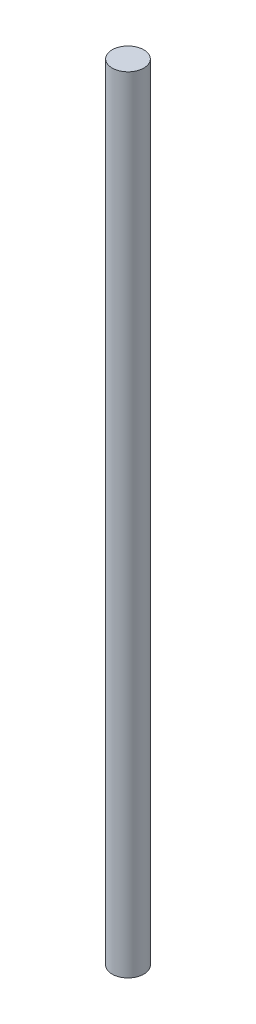
ISO-10303-21;
HEADER;
FILE_DESCRIPTION(('STEP AP214'),'2;1');
FILE_NAME('part.step','',(''),(''),'','','');
FILE_SCHEMA(('AUTOMOTIVE_DESIGN { 1 0 10303 214 1 1 1 1 }'));
ENDSEC;
DATA;
#1=APPLICATION_CONTEXT('core data for automotive mechanical design processes');
#2=APPLICATION_PROTOCOL_DEFINITION('international standard','automotive_design',2000,#1);
#3=PRODUCT_CONTEXT('',#1,'mechanical');
#4=PRODUCT('Part','Part','',(#3));
#5=PRODUCT_RELATED_PRODUCT_CATEGORY('part','',(#4));
#6=PRODUCT_DEFINITION_FORMATION('','',#4);
#7=PRODUCT_DEFINITION_CONTEXT('part definition',#1,'design');
#8=PRODUCT_DEFINITION('design','',#6,#7);
#9=PRODUCT_DEFINITION_SHAPE('','',#8);
#10=(LENGTH_UNIT() NAMED_UNIT(*) SI_UNIT(.MILLI.,.METRE.));
#11=(NAMED_UNIT(*) PLANE_ANGLE_UNIT() SI_UNIT($,.RADIAN.));
#12=(NAMED_UNIT(*) SI_UNIT($,.STERADIAN.) SOLID_ANGLE_UNIT());
#13=UNCERTAINTY_MEASURE_WITH_UNIT(LENGTH_MEASURE(1.E-05),#10,'distance_accuracy_value','');
#14=(GEOMETRIC_REPRESENTATION_CONTEXT(3) GLOBAL_UNCERTAINTY_ASSIGNED_CONTEXT((#13)) GLOBAL_UNIT_ASSIGNED_CONTEXT((#10,
#11,#12)) REPRESENTATION_CONTEXT('',''));
#15=CARTESIAN_POINT('',(0.,0.,0.));
#16=DIRECTION('',(0.,0.,1.));
#17=DIRECTION('',(1.,0.,0.));
#18=AXIS2_PLACEMENT_3D('',#15,#16,#17);
#19=CARTESIAN_POINT('',(0.,-4.8,0.));
#20=DIRECTION('',(0.,-1.,0.));
#21=DIRECTION('',(1.,0.,0.));
#22=AXIS2_PLACEMENT_3D('',#19,#20,#21);
#23=PLANE('',#22);
#24=CARTESIAN_POINT('',(0.,-4.8,0.));
#25=DIRECTION('',(0.,1.,0.));
#26=DIRECTION('',(-1.,0.,0.));
#27=AXIS2_PLACEMENT_3D('',#24,#25,#26);
#28=CIRCLE('',#27,0.999999999999991);
#29=CARTESIAN_POINT('',(-0.999999999999991,-4.8,0.));
#30=VERTEX_POINT('',#29);
#31=EDGE_CURVE('E10',#30,#30,#28,.T.);
#32=ORIENTED_EDGE('',*,*,#31,.F.);
#33=EDGE_LOOP('',(#32));
#34=FACE_BOUND('',#33,.T.);
#35=ADVANCED_FACE('F34',(#34),#23,.T.);
#36=CARTESIAN_POINT('',(0.,67.5860606758015,0.));
#37=DIRECTION('',(0.,1.,0.));
#38=DIRECTION('',(-1.,0.,0.));
#39=AXIS2_PLACEMENT_3D('',#36,#37,#38);
#40=CYLINDRICAL_SURFACE('',#39,0.999999999999994);
#41=ORIENTED_EDGE('',*,*,#31,.T.);
#42=EDGE_LOOP('',(#41));
#43=FACE_BOUND('',#42,.T.);
#44=CARTESIAN_POINT('',(0.,44.8,0.));
#45=DIRECTION('',(0.,1.,0.));
#46=DIRECTION('',(-1.,0.,0.));
#47=AXIS2_PLACEMENT_3D('',#44,#45,#46);
#48=CIRCLE('',#47,0.999999999999997);
#49=CARTESIAN_POINT('',(-0.999999999999997,44.8,0.));
#50=VERTEX_POINT('',#49);
#51=EDGE_CURVE('E40',#50,#50,#48,.T.);
#52=ORIENTED_EDGE('',*,*,#51,.F.);
#53=EDGE_LOOP('',(#52));
#54=FACE_BOUND('',#53,.T.);
#55=ADVANCED_FACE('F48',(#43,#54),#40,.T.);
#56=CARTESIAN_POINT('',(0.,44.8,0.));
#57=DIRECTION('',(0.,1.,0.));
#58=DIRECTION('',(-1.,0.,0.));
#59=AXIS2_PLACEMENT_3D('',#56,#57,#58);
#60=PLANE('',#59);
#61=ORIENTED_EDGE('',*,*,#51,.T.);
#62=EDGE_LOOP('',(#61));
#63=FACE_BOUND('',#62,.T.);
#64=ADVANCED_FACE('F46',(#63),#60,.T.);
#65=CLOSED_SHELL('',(#35,#55,#64));
#66=MANIFOLD_SOLID_BREP('B2',#65);
#67=ADVANCED_BREP_SHAPE_REPRESENTATION('',(#18,#66),#14);
#68=SHAPE_DEFINITION_REPRESENTATION(#9,#67);
ENDSEC;
END-ISO-10303-21;
